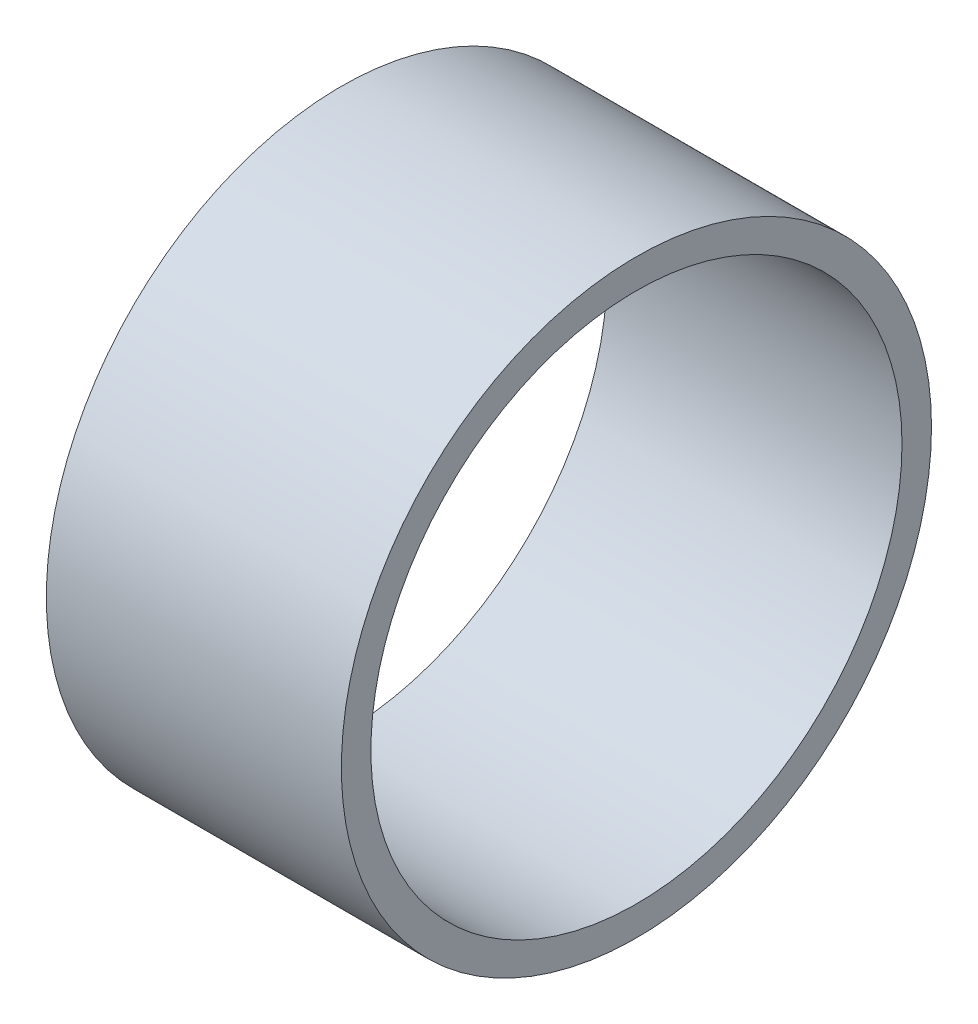
ISO-10303-21;
HEADER;
FILE_DESCRIPTION(('STEP AP214'),'2;1');
FILE_NAME('part.step','',(''),(''),'','','');
FILE_SCHEMA(('AUTOMOTIVE_DESIGN { 1 0 10303 214 1 1 1 1 }'));
ENDSEC;
DATA;
#1=APPLICATION_CONTEXT('core data for automotive mechanical design processes');
#2=APPLICATION_PROTOCOL_DEFINITION('international standard','automotive_design',2000,#1);
#3=PRODUCT_CONTEXT('',#1,'mechanical');
#4=PRODUCT('Part','Part','',(#3));
#5=PRODUCT_RELATED_PRODUCT_CATEGORY('part','',(#4));
#6=PRODUCT_DEFINITION_FORMATION('','',#4);
#7=PRODUCT_DEFINITION_CONTEXT('part definition',#1,'design');
#8=PRODUCT_DEFINITION('design','',#6,#7);
#9=PRODUCT_DEFINITION_SHAPE('','',#8);
#10=(LENGTH_UNIT() NAMED_UNIT(*) SI_UNIT(.MILLI.,.METRE.));
#11=(NAMED_UNIT(*) PLANE_ANGLE_UNIT() SI_UNIT($,.RADIAN.));
#12=(NAMED_UNIT(*) SI_UNIT($,.STERADIAN.) SOLID_ANGLE_UNIT());
#13=UNCERTAINTY_MEASURE_WITH_UNIT(LENGTH_MEASURE(1.E-05),#10,'distance_accuracy_value','');
#14=(GEOMETRIC_REPRESENTATION_CONTEXT(3) GLOBAL_UNCERTAINTY_ASSIGNED_CONTEXT((#13)) GLOBAL_UNIT_ASSIGNED_CONTEXT((#10,
#11,#12)) REPRESENTATION_CONTEXT('',''));
#15=CARTESIAN_POINT('',(0.,0.,0.));
#16=DIRECTION('',(0.,0.,1.));
#17=DIRECTION('',(1.,0.,0.));
#18=AXIS2_PLACEMENT_3D('',#15,#16,#17);
#19=CARTESIAN_POINT('',(100.,0.,0.));
#20=DIRECTION('',(1.,0.,0.));
#21=DIRECTION('',(0.,0.,-1.));
#22=AXIS2_PLACEMENT_3D('',#19,#20,#21);
#23=PLANE('',#22);
#24=CARTESIAN_POINT('',(100.,0.,0.));
#25=DIRECTION('',(1.,0.,0.));
#26=DIRECTION('',(0.,0.,-1.));
#27=AXIS2_PLACEMENT_3D('',#24,#25,#26);
#28=CIRCLE('',#27,100.);
#29=CARTESIAN_POINT('',(100.,0.,-100.));
#30=VERTEX_POINT('',#29);
#31=EDGE_CURVE('E10',#30,#30,#28,.T.);
#32=ORIENTED_EDGE('',*,*,#31,.T.);
#33=EDGE_LOOP('',(#32));
#34=FACE_BOUND('',#33,.T.);
#35=CARTESIAN_POINT('',(100.,0.,0.));
#36=DIRECTION('',(1.,0.,0.));
#37=DIRECTION('',(0.,0.,-1.));
#38=AXIS2_PLACEMENT_3D('',#35,#36,#37);
#39=CIRCLE('',#38,90.);
#40=CARTESIAN_POINT('',(100.,0.,-90.));
#41=VERTEX_POINT('',#40);
#42=EDGE_CURVE('E48',#41,#41,#39,.T.);
#43=ORIENTED_EDGE('',*,*,#42,.F.);
#44=EDGE_LOOP('',(#43));
#45=FACE_BOUND('',#44,.T.);
#46=ADVANCED_FACE('F40',(#34,#45),#23,.T.);
#47=CARTESIAN_POINT('',(0.,0.,0.));
#48=DIRECTION('',(1.,0.,0.));
#49=DIRECTION('',(0.,0.,-1.));
#50=AXIS2_PLACEMENT_3D('',#47,#48,#49);
#51=PLANE('',#50);
#52=CARTESIAN_POINT('',(0.,0.,0.));
#53=DIRECTION('',(1.,0.,0.));
#54=DIRECTION('',(0.,0.,-1.));
#55=AXIS2_PLACEMENT_3D('',#52,#53,#54);
#56=CIRCLE('',#55,100.);
#57=CARTESIAN_POINT('',(0.,0.,-100.));
#58=VERTEX_POINT('',#57);
#59=EDGE_CURVE('E41',#58,#58,#56,.T.);
#60=ORIENTED_EDGE('',*,*,#59,.F.);
#61=EDGE_LOOP('',(#60));
#62=FACE_BOUND('',#61,.T.);
#63=CARTESIAN_POINT('',(0.,0.,0.));
#64=DIRECTION('',(1.,0.,0.));
#65=DIRECTION('',(0.,0.,-1.));
#66=AXIS2_PLACEMENT_3D('',#63,#64,#65);
#67=CIRCLE('',#66,90.);
#68=CARTESIAN_POINT('',(0.,0.,-90.));
#69=VERTEX_POINT('',#68);
#70=EDGE_CURVE('E49',#69,#69,#67,.T.);
#71=ORIENTED_EDGE('',*,*,#70,.T.);
#72=EDGE_LOOP('',(#71));
#73=FACE_BOUND('',#72,.T.);
#74=ADVANCED_FACE('F58',(#62,#73),#51,.F.);
#75=CARTESIAN_POINT('',(100.,0.,0.));
#76=DIRECTION('',(-1.,0.,0.));
#77=DIRECTION('',(0.,0.,1.));
#78=AXIS2_PLACEMENT_3D('',#75,#76,#77);
#79=CYLINDRICAL_SURFACE('',#78,100.);
#80=ORIENTED_EDGE('',*,*,#31,.F.);
#81=EDGE_LOOP('',(#80));
#82=FACE_BOUND('',#81,.T.);
#83=ORIENTED_EDGE('',*,*,#59,.T.);
#84=EDGE_LOOP('',(#83));
#85=FACE_BOUND('',#84,.T.);
#86=ADVANCED_FACE('F39',(#82,#85),#79,.T.);
#87=CARTESIAN_POINT('',(100.,0.,0.));
#88=DIRECTION('',(-1.,0.,0.));
#89=DIRECTION('',(0.,0.,1.));
#90=AXIS2_PLACEMENT_3D('',#87,#88,#89);
#91=CYLINDRICAL_SURFACE('',#90,90.);
#92=ORIENTED_EDGE('',*,*,#42,.T.);
#93=EDGE_LOOP('',(#92));
#94=FACE_BOUND('',#93,.T.);
#95=ORIENTED_EDGE('',*,*,#70,.F.);
#96=EDGE_LOOP('',(#95));
#97=FACE_BOUND('',#96,.T.);
#98=ADVANCED_FACE('F57',(#94,#97),#91,.F.);
#99=CLOSED_SHELL('',(#46,#74,#86,#98));
#100=MANIFOLD_SOLID_BREP('B2',#99);
#101=ADVANCED_BREP_SHAPE_REPRESENTATION('',(#18,#100),#14);
#102=SHAPE_DEFINITION_REPRESENTATION(#9,#101);
ENDSEC;
END-ISO-10303-21;
